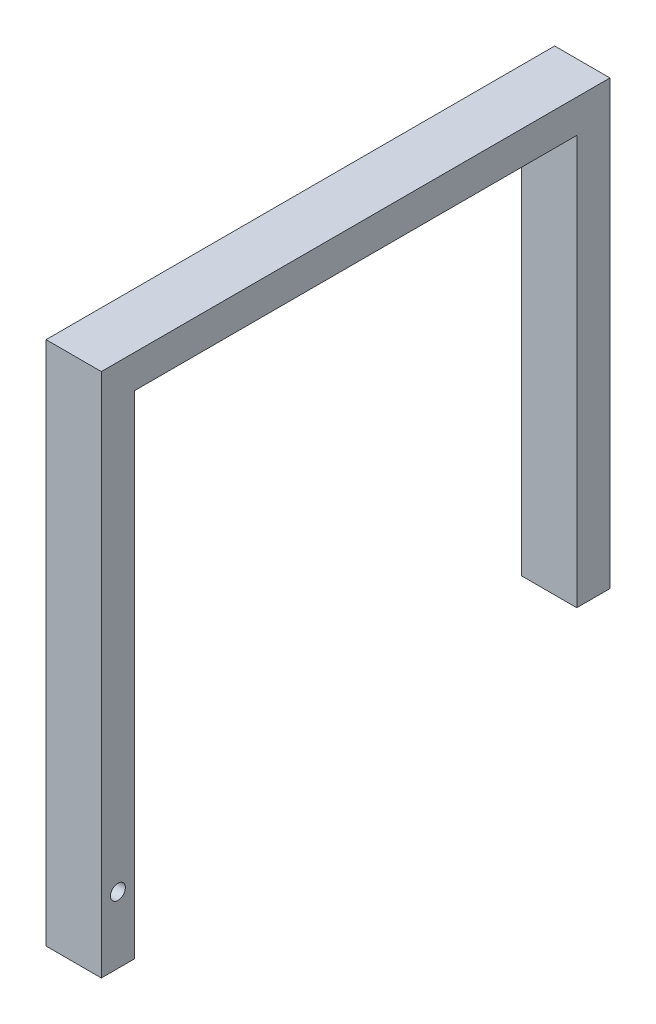
ISO-10303-21;
HEADER;
FILE_DESCRIPTION(('STEP AP214'),'2;1');
FILE_NAME('part.step','',(''),(''),'','','');
FILE_SCHEMA(('AUTOMOTIVE_DESIGN { 1 0 10303 214 1 1 1 1 }'));
ENDSEC;
DATA;
#1=APPLICATION_CONTEXT('core data for automotive mechanical design processes');
#2=APPLICATION_PROTOCOL_DEFINITION('international standard','automotive_design',2000,#1);
#3=PRODUCT_CONTEXT('',#1,'mechanical');
#4=PRODUCT('Part','Part','',(#3));
#5=PRODUCT_RELATED_PRODUCT_CATEGORY('part','',(#4));
#6=PRODUCT_DEFINITION_FORMATION('','',#4);
#7=PRODUCT_DEFINITION_CONTEXT('part definition',#1,'design');
#8=PRODUCT_DEFINITION('design','',#6,#7);
#9=PRODUCT_DEFINITION_SHAPE('','',#8);
#10=(LENGTH_UNIT() NAMED_UNIT(*) SI_UNIT(.MILLI.,.METRE.));
#11=(NAMED_UNIT(*) PLANE_ANGLE_UNIT() SI_UNIT($,.RADIAN.));
#12=(NAMED_UNIT(*) SI_UNIT($,.STERADIAN.) SOLID_ANGLE_UNIT());
#13=UNCERTAINTY_MEASURE_WITH_UNIT(LENGTH_MEASURE(1.E-05),#10,'distance_accuracy_value','');
#14=(GEOMETRIC_REPRESENTATION_CONTEXT(3) GLOBAL_UNCERTAINTY_ASSIGNED_CONTEXT((#13)) GLOBAL_UNIT_ASSIGNED_CONTEXT((#10,
#11,#12)) REPRESENTATION_CONTEXT('',''));
#15=CARTESIAN_POINT('',(0.,0.,0.));
#16=DIRECTION('',(0.,0.,1.));
#17=DIRECTION('',(1.,0.,0.));
#18=AXIS2_PLACEMENT_3D('',#15,#16,#17);
#19=CARTESIAN_POINT('',(5.,40.,3.));
#20=DIRECTION('',(-1.,0.,0.));
#21=DIRECTION('',(0.,0.,1.));
#22=AXIS2_PLACEMENT_3D('',#19,#20,#21);
#23=PLANE('',#22);
#24=CARTESIAN_POINT('',(5.,-43.,86.));
#25=DIRECTION('',(1.,0.,0.));
#26=DIRECTION('',(0.,0.,-1.));
#27=AXIS2_PLACEMENT_3D('',#24,#25,#26);
#28=CIRCLE('',#27,1.35000000000001);
#29=CARTESIAN_POINT('',(5.,-43.,84.65));
#30=VERTEX_POINT('',#29);
#31=EDGE_CURVE('E171',#30,#30,#28,.T.);
#32=ORIENTED_EDGE('',*,*,#31,.F.);
#33=EDGE_LOOP('',(#32));
#34=FACE_BOUND('',#33,.T.);
#35=DIRECTION('',(0.,0.,-1.));
#36=VECTOR('',#35,1.);
#37=CARTESIAN_POINT('',(5.,-40.,3.));
#38=LINE('',#37,#36);
#39=CARTESIAN_POINT('',(5.,-40.,3.));
#40=VERTEX_POINT('',#39);
#41=CARTESIAN_POINT('',(5.,-40.,-3.));
#42=VERTEX_POINT('',#41);
#43=EDGE_CURVE('E92',#40,#42,#38,.T.);
#44=ORIENTED_EDGE('',*,*,#43,.T.);
#45=DIRECTION('',(0.,-1.,0.));
#46=VECTOR('',#45,1.);
#47=CARTESIAN_POINT('',(5.,40.,-3.));
#48=LINE('',#47,#46);
#49=CARTESIAN_POINT('',(5.,40.,-3.));
#50=VERTEX_POINT('',#49);
#51=EDGE_CURVE('E11',#50,#42,#48,.T.);
#52=ORIENTED_EDGE('',*,*,#51,.F.);
#53=DIRECTION('',(0.,0.,-1.));
#54=VECTOR('',#53,1.);
#55=CARTESIAN_POINT('',(5.,40.,3.));
#56=LINE('',#55,#54);
#57=CARTESIAN_POINT('',(5.00000000000001,40.,89.));
#58=VERTEX_POINT('',#57);
#59=EDGE_CURVE('E109',#58,#50,#56,.T.);
#60=ORIENTED_EDGE('',*,*,#59,.F.);
#61=DIRECTION('',(0.,1.,0.));
#62=VECTOR('',#61,1.);
#63=CARTESIAN_POINT('',(5.00000000000001,-55.,89.));
#64=LINE('',#63,#62);
#65=CARTESIAN_POINT('',(5.00000000000001,-55.,89.));
#66=VERTEX_POINT('',#65);
#67=EDGE_CURVE('E142',#66,#58,#64,.T.);
#68=ORIENTED_EDGE('',*,*,#67,.F.);
#69=DIRECTION('',(0.,0.,-1.));
#70=VECTOR('',#69,1.);
#71=CARTESIAN_POINT('',(5.00000000000001,-55.,83.));
#72=LINE('',#71,#70);
#73=CARTESIAN_POINT('',(5.00000000000001,-55.,83.));
#74=VERTEX_POINT('',#73);
#75=EDGE_CURVE('E203',#66,#74,#72,.T.);
#76=ORIENTED_EDGE('',*,*,#75,.T.);
#77=DIRECTION('',(0.,1.,0.));
#78=VECTOR('',#77,1.);
#79=CARTESIAN_POINT('',(5.00000000000001,-55.,83.));
#80=LINE('',#79,#78);
#81=CARTESIAN_POINT('',(5.00000000000001,34.,83.));
#82=VERTEX_POINT('',#81);
#83=EDGE_CURVE('E159',#74,#82,#80,.T.);
#84=ORIENTED_EDGE('',*,*,#83,.T.);
#85=DIRECTION('',(0.,0.,-1.));
#86=VECTOR('',#85,1.);
#87=CARTESIAN_POINT('',(5.,34.,3.));
#88=LINE('',#87,#86);
#89=CARTESIAN_POINT('',(5.,34.,3.));
#90=VERTEX_POINT('',#89);
#91=EDGE_CURVE('E95',#82,#90,#88,.T.);
#92=ORIENTED_EDGE('',*,*,#91,.T.);
#93=DIRECTION('',(0.,-1.,0.));
#94=VECTOR('',#93,1.);
#95=CARTESIAN_POINT('',(5.,40.,3.));
#96=LINE('',#95,#94);
#97=EDGE_CURVE('E88',#90,#40,#96,.T.);
#98=ORIENTED_EDGE('',*,*,#97,.T.);
#99=EDGE_LOOP('',(#44,#52,#60,#68,#76,#84,#92,#98));
#100=FACE_BOUND('',#99,.T.);
#101=ADVANCED_FACE('F43',(#34,#100),#23,.F.);
#102=CARTESIAN_POINT('',(-5.,40.,-3.));
#103=DIRECTION('',(0.,0.,1.));
#104=DIRECTION('',(1.,0.,0.));
#105=AXIS2_PLACEMENT_3D('',#102,#103,#104);
#106=PLANE('',#105);
#107=DIRECTION('',(-1.,0.,0.));
#108=VECTOR('',#107,1.);
#109=CARTESIAN_POINT('',(-5.,-40.,-3.));
#110=LINE('',#109,#108);
#111=CARTESIAN_POINT('',(-5.,-40.,-3.));
#112=VERTEX_POINT('',#111);
#113=EDGE_CURVE('E113',#42,#112,#110,.T.);
#114=ORIENTED_EDGE('',*,*,#113,.T.);
#115=DIRECTION('',(0.,-1.,0.));
#116=VECTOR('',#115,1.);
#117=CARTESIAN_POINT('',(-5.,40.,-3.));
#118=LINE('',#117,#116);
#119=CARTESIAN_POINT('',(-5.,40.,-3.));
#120=VERTEX_POINT('',#119);
#121=EDGE_CURVE('E52',#120,#112,#118,.T.);
#122=ORIENTED_EDGE('',*,*,#121,.F.);
#123=DIRECTION('',(-1.,0.,0.));
#124=VECTOR('',#123,1.);
#125=CARTESIAN_POINT('',(-5.,40.,-3.));
#126=LINE('',#125,#124);
#127=EDGE_CURVE('E68',#50,#120,#126,.T.);
#128=ORIENTED_EDGE('',*,*,#127,.F.);
#129=ORIENTED_EDGE('',*,*,#51,.T.);
#130=EDGE_LOOP('',(#114,#122,#128,#129));
#131=FACE_BOUND('',#130,.T.);
#132=ADVANCED_FACE('F135',(#131),#106,.F.);
#133=CARTESIAN_POINT('',(-5.,40.,3.));
#134=DIRECTION('',(1.,0.,0.));
#135=DIRECTION('',(0.,0.,-1.));
#136=AXIS2_PLACEMENT_3D('',#133,#134,#135);
#137=PLANE('',#136);
#138=CARTESIAN_POINT('',(-5.,-43.,86.));
#139=DIRECTION('',(1.,0.,0.));
#140=DIRECTION('',(0.,0.,-1.));
#141=AXIS2_PLACEMENT_3D('',#138,#139,#140);
#142=CIRCLE('',#141,1.35000000000001);
#143=CARTESIAN_POINT('',(-5.,-43.,84.65));
#144=VERTEX_POINT('',#143);
#145=EDGE_CURVE('E46',#144,#144,#142,.T.);
#146=ORIENTED_EDGE('',*,*,#145,.T.);
#147=EDGE_LOOP('',(#146));
#148=FACE_BOUND('',#147,.T.);
#149=DIRECTION('',(0.,0.,1.));
#150=VECTOR('',#149,1.);
#151=CARTESIAN_POINT('',(-5.,-40.,3.));
#152=LINE('',#151,#150);
#153=CARTESIAN_POINT('',(-5.,-40.,3.));
#154=VERTEX_POINT('',#153);
#155=EDGE_CURVE('E110',#112,#154,#152,.T.);
#156=ORIENTED_EDGE('',*,*,#155,.T.);
#157=DIRECTION('',(0.,-1.,0.));
#158=VECTOR('',#157,1.);
#159=CARTESIAN_POINT('',(-5.,40.,3.));
#160=LINE('',#159,#158);
#161=CARTESIAN_POINT('',(-5.,34.,3.));
#162=VERTEX_POINT('',#161);
#163=EDGE_CURVE('E98',#162,#154,#160,.T.);
#164=ORIENTED_EDGE('',*,*,#163,.F.);
#165=DIRECTION('',(0.,0.,1.));
#166=VECTOR('',#165,1.);
#167=CARTESIAN_POINT('',(-5.,34.,3.));
#168=LINE('',#167,#166);
#169=CARTESIAN_POINT('',(-4.99999999999999,34.,83.));
#170=VERTEX_POINT('',#169);
#171=EDGE_CURVE('E59',#162,#170,#168,.T.);
#172=ORIENTED_EDGE('',*,*,#171,.T.);
#173=DIRECTION('',(0.,1.,0.));
#174=VECTOR('',#173,1.);
#175=CARTESIAN_POINT('',(-4.99999999999999,-55.,83.));
#176=LINE('',#175,#174);
#177=CARTESIAN_POINT('',(-4.99999999999999,-55.,83.));
#178=VERTEX_POINT('',#177);
#179=EDGE_CURVE('E176',#178,#170,#176,.T.);
#180=ORIENTED_EDGE('',*,*,#179,.F.);
#181=DIRECTION('',(0.,0.,1.));
#182=VECTOR('',#181,1.);
#183=CARTESIAN_POINT('',(-4.99999999999999,-55.,89.));
#184=LINE('',#183,#182);
#185=CARTESIAN_POINT('',(-4.99999999999999,-55.,89.));
#186=VERTEX_POINT('',#185);
#187=EDGE_CURVE('E164',#178,#186,#184,.T.);
#188=ORIENTED_EDGE('',*,*,#187,.T.);
#189=DIRECTION('',(0.,1.,0.));
#190=VECTOR('',#189,1.);
#191=CARTESIAN_POINT('',(-4.99999999999999,-55.,89.));
#192=LINE('',#191,#190);
#193=CARTESIAN_POINT('',(-4.99999999999999,40.,89.));
#194=VERTEX_POINT('',#193);
#195=EDGE_CURVE('E160',#186,#194,#192,.T.);
#196=ORIENTED_EDGE('',*,*,#195,.T.);
#197=DIRECTION('',(0.,0.,1.));
#198=VECTOR('',#197,1.);
#199=CARTESIAN_POINT('',(-5.,40.,3.));
#200=LINE('',#199,#198);
#201=EDGE_CURVE('E99',#120,#194,#200,.T.);
#202=ORIENTED_EDGE('',*,*,#201,.F.);
#203=ORIENTED_EDGE('',*,*,#121,.T.);
#204=EDGE_LOOP('',(#156,#164,#172,#180,#188,#196,#202,#203));
#205=FACE_BOUND('',#204,.T.);
#206=ADVANCED_FACE('F132',(#148,#205),#137,.F.);
#207=CARTESIAN_POINT('',(-5.,40.,3.));
#208=DIRECTION('',(0.,0.,-1.));
#209=DIRECTION('',(-1.,0.,0.));
#210=AXIS2_PLACEMENT_3D('',#207,#208,#209);
#211=PLANE('',#210);
#212=ORIENTED_EDGE('',*,*,#97,.F.);
#213=DIRECTION('',(-1.,0.,0.));
#214=VECTOR('',#213,1.);
#215=CARTESIAN_POINT('',(-5.,34.,3.));
#216=LINE('',#215,#214);
#217=EDGE_CURVE('E180',#90,#162,#216,.T.);
#218=ORIENTED_EDGE('',*,*,#217,.T.);
#219=ORIENTED_EDGE('',*,*,#163,.T.);
#220=DIRECTION('',(1.,0.,0.));
#221=VECTOR('',#220,1.);
#222=CARTESIAN_POINT('',(-5.,-40.,3.));
#223=LINE('',#222,#221);
#224=EDGE_CURVE('E102',#154,#40,#223,.T.);
#225=ORIENTED_EDGE('',*,*,#224,.T.);
#226=EDGE_LOOP('',(#212,#218,#219,#225));
#227=FACE_BOUND('',#226,.T.);
#228=ADVANCED_FACE('F103',(#227),#211,.F.);
#229=CARTESIAN_POINT('',(0.,40.,0.));
#230=DIRECTION('',(0.,-1.,0.));
#231=DIRECTION('',(0.,0.,-1.));
#232=AXIS2_PLACEMENT_3D('',#229,#230,#231);
#233=PLANE('',#232);
#234=ORIENTED_EDGE('',*,*,#59,.T.);
#235=ORIENTED_EDGE('',*,*,#127,.T.);
#236=ORIENTED_EDGE('',*,*,#201,.T.);
#237=DIRECTION('',(1.,0.,0.));
#238=VECTOR('',#237,1.);
#239=CARTESIAN_POINT('',(5.00000000000001,40.,89.));
#240=LINE('',#239,#238);
#241=EDGE_CURVE('E155',#194,#58,#240,.T.);
#242=ORIENTED_EDGE('',*,*,#241,.T.);
#243=EDGE_LOOP('',(#234,#235,#236,#242));
#244=FACE_BOUND('',#243,.T.);
#245=ADVANCED_FACE('F162',(#244),#233,.F.);
#246=CARTESIAN_POINT('',(0.,-40.,0.));
#247=DIRECTION('',(0.,-1.,0.));
#248=DIRECTION('',(0.,0.,-1.));
#249=AXIS2_PLACEMENT_3D('',#246,#247,#248);
#250=PLANE('',#249);
#251=ORIENTED_EDGE('',*,*,#43,.F.);
#252=ORIENTED_EDGE('',*,*,#224,.F.);
#253=ORIENTED_EDGE('',*,*,#155,.F.);
#254=ORIENTED_EDGE('',*,*,#113,.F.);
#255=EDGE_LOOP('',(#251,#252,#253,#254));
#256=FACE_BOUND('',#255,.T.);
#257=ADVANCED_FACE('F112',(#256),#250,.T.);
#258=CARTESIAN_POINT('',(0.,34.,0.));
#259=DIRECTION('',(0.,-1.,0.));
#260=DIRECTION('',(0.,0.,-1.));
#261=AXIS2_PLACEMENT_3D('',#258,#259,#260);
#262=PLANE('',#261);
#263=ORIENTED_EDGE('',*,*,#217,.F.);
#264=ORIENTED_EDGE('',*,*,#91,.F.);
#265=DIRECTION('',(1.,0.,0.));
#266=VECTOR('',#265,1.);
#267=CARTESIAN_POINT('',(5.00000000000001,34.,83.));
#268=LINE('',#267,#266);
#269=EDGE_CURVE('E119',#170,#82,#268,.T.);
#270=ORIENTED_EDGE('',*,*,#269,.F.);
#271=ORIENTED_EDGE('',*,*,#171,.F.);
#272=EDGE_LOOP('',(#263,#264,#270,#271));
#273=FACE_BOUND('',#272,.T.);
#274=ADVANCED_FACE('F235',(#273),#262,.T.);
#275=CARTESIAN_POINT('',(-4.99999999999999,-55.,83.));
#276=DIRECTION('',(0.,0.,-1.));
#277=DIRECTION('',(-1.,0.,0.));
#278=AXIS2_PLACEMENT_3D('',#275,#276,#277);
#279=PLANE('',#278);
#280=ORIENTED_EDGE('',*,*,#179,.T.);
#281=ORIENTED_EDGE('',*,*,#269,.T.);
#282=ORIENTED_EDGE('',*,*,#83,.F.);
#283=DIRECTION('',(-1.,0.,0.));
#284=VECTOR('',#283,1.);
#285=CARTESIAN_POINT('',(-4.99999999999999,-55.,83.));
#286=LINE('',#285,#284);
#287=EDGE_CURVE('E174',#74,#178,#286,.T.);
#288=ORIENTED_EDGE('',*,*,#287,.T.);
#289=EDGE_LOOP('',(#280,#281,#282,#288));
#290=FACE_BOUND('',#289,.T.);
#291=ADVANCED_FACE('F196',(#290),#279,.T.);
#292=CARTESIAN_POINT('',(5.00000000000001,-55.,89.));
#293=DIRECTION('',(0.,0.,1.));
#294=DIRECTION('',(1.,0.,0.));
#295=AXIS2_PLACEMENT_3D('',#292,#293,#294);
#296=PLANE('',#295);
#297=ORIENTED_EDGE('',*,*,#241,.F.);
#298=ORIENTED_EDGE('',*,*,#195,.F.);
#299=DIRECTION('',(1.,0.,0.));
#300=VECTOR('',#299,1.);
#301=CARTESIAN_POINT('',(5.00000000000001,-55.,89.));
#302=LINE('',#301,#300);
#303=EDGE_CURVE('E157',#186,#66,#302,.T.);
#304=ORIENTED_EDGE('',*,*,#303,.T.);
#305=ORIENTED_EDGE('',*,*,#67,.T.);
#306=EDGE_LOOP('',(#297,#298,#304,#305));
#307=FACE_BOUND('',#306,.T.);
#308=ADVANCED_FACE('F153',(#307),#296,.T.);
#309=CARTESIAN_POINT('',(0.,-55.,0.));
#310=DIRECTION('',(0.,-1.,0.));
#311=DIRECTION('',(0.,0.,-1.));
#312=AXIS2_PLACEMENT_3D('',#309,#310,#311);
#313=PLANE('',#312);
#314=ORIENTED_EDGE('',*,*,#187,.F.);
#315=ORIENTED_EDGE('',*,*,#287,.F.);
#316=ORIENTED_EDGE('',*,*,#75,.F.);
#317=ORIENTED_EDGE('',*,*,#303,.F.);
#318=EDGE_LOOP('',(#314,#315,#316,#317));
#319=FACE_BOUND('',#318,.T.);
#320=ADVANCED_FACE('F209',(#319),#313,.T.);
#321=CARTESIAN_POINT('',(-75.,-43.,86.));
#322=DIRECTION('',(1.,0.,0.));
#323=DIRECTION('',(0.,0.,-1.));
#324=AXIS2_PLACEMENT_3D('',#321,#322,#323);
#325=CYLINDRICAL_SURFACE('',#324,1.35000000000001);
#326=ORIENTED_EDGE('',*,*,#31,.T.);
#327=EDGE_LOOP('',(#326));
#328=FACE_BOUND('',#327,.T.);
#329=ORIENTED_EDGE('',*,*,#145,.F.);
#330=EDGE_LOOP('',(#329));
#331=FACE_BOUND('',#330,.T.);
#332=ADVANCED_FACE('F218',(#328,#331),#325,.F.);
#333=CLOSED_SHELL('',(#101,#132,#206,#228,#245,#257,#274,#291,#308,#320,#332));
#334=MANIFOLD_SOLID_BREP('B2',#333);
#335=ADVANCED_BREP_SHAPE_REPRESENTATION('',(#18,#334),#14);
#336=SHAPE_DEFINITION_REPRESENTATION(#9,#335);
ENDSEC;
END-ISO-10303-21;
